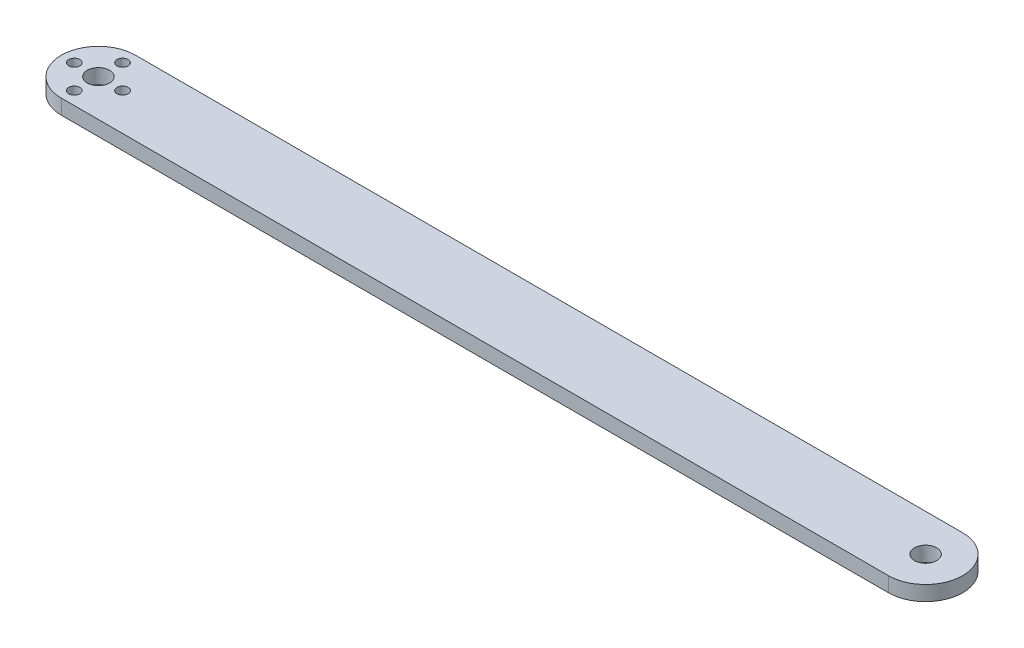
ISO-10303-21;
HEADER;
FILE_DESCRIPTION(('STEP AP214'),'2;1');
FILE_NAME('part.step','',(''),(''),'','','');
FILE_SCHEMA(('AUTOMOTIVE_DESIGN { 1 0 10303 214 1 1 1 1 }'));
ENDSEC;
DATA;
#1=APPLICATION_CONTEXT('core data for automotive mechanical design processes');
#2=APPLICATION_PROTOCOL_DEFINITION('international standard','automotive_design',2000,#1);
#3=PRODUCT_CONTEXT('',#1,'mechanical');
#4=PRODUCT('Part','Part','',(#3));
#5=PRODUCT_RELATED_PRODUCT_CATEGORY('part','',(#4));
#6=PRODUCT_DEFINITION_FORMATION('','',#4);
#7=PRODUCT_DEFINITION_CONTEXT('part definition',#1,'design');
#8=PRODUCT_DEFINITION('design','',#6,#7);
#9=PRODUCT_DEFINITION_SHAPE('','',#8);
#10=(LENGTH_UNIT() NAMED_UNIT(*) SI_UNIT(.MILLI.,.METRE.));
#11=(NAMED_UNIT(*) PLANE_ANGLE_UNIT() SI_UNIT($,.RADIAN.));
#12=(NAMED_UNIT(*) SI_UNIT($,.STERADIAN.) SOLID_ANGLE_UNIT());
#13=UNCERTAINTY_MEASURE_WITH_UNIT(LENGTH_MEASURE(1.E-05),#10,'distance_accuracy_value','');
#14=(GEOMETRIC_REPRESENTATION_CONTEXT(3) GLOBAL_UNCERTAINTY_ASSIGNED_CONTEXT((#13)) GLOBAL_UNIT_ASSIGNED_CONTEXT((#10,
#11,#12)) REPRESENTATION_CONTEXT('',''));
#15=CARTESIAN_POINT('',(0.,0.,0.));
#16=DIRECTION('',(0.,0.,1.));
#17=DIRECTION('',(1.,0.,0.));
#18=AXIS2_PLACEMENT_3D('',#15,#16,#17);
#19=CARTESIAN_POINT('',(-111.375,4.,0.));
#20=DIRECTION('',(0.,1.,0.));
#21=DIRECTION('',(0.,0.,1.));
#22=AXIS2_PLACEMENT_3D('',#19,#20,#21);
#23=PLANE('',#22);
#24=CARTESIAN_POINT('',(-104.875,4.,0.));
#25=DIRECTION('',(0.,1.,0.));
#26=DIRECTION('',(-1.,0.,0.));
#27=AXIS2_PLACEMENT_3D('',#24,#25,#26);
#28=CIRCLE('',#27,1.5);
#29=CARTESIAN_POINT('',(-106.375,4.,0.));
#30=VERTEX_POINT('',#29);
#31=EDGE_CURVE('E150',#30,#30,#28,.T.);
#32=ORIENTED_EDGE('',*,*,#31,.F.);
#33=EDGE_LOOP('',(#32));
#34=FACE_BOUND('',#33,.T.);
#35=CARTESIAN_POINT('',(-111.375,4.,6.5));
#36=DIRECTION('',(0.,1.,0.));
#37=DIRECTION('',(0.,0.,-1.));
#38=AXIS2_PLACEMENT_3D('',#35,#36,#37);
#39=CIRCLE('',#38,1.5);
#40=CARTESIAN_POINT('',(-111.375,4.,5.));
#41=VERTEX_POINT('',#40);
#42=EDGE_CURVE('E144',#41,#41,#39,.T.);
#43=ORIENTED_EDGE('',*,*,#42,.F.);
#44=EDGE_LOOP('',(#43));
#45=FACE_BOUND('',#44,.T.);
#46=CARTESIAN_POINT('',(-117.875,4.,0.));
#47=DIRECTION('',(0.,1.,0.));
#48=DIRECTION('',(1.,0.,0.));
#49=AXIS2_PLACEMENT_3D('',#46,#47,#48);
#50=CIRCLE('',#49,1.5);
#51=CARTESIAN_POINT('',(-116.375,4.,0.));
#52=VERTEX_POINT('',#51);
#53=EDGE_CURVE('E138',#52,#52,#50,.T.);
#54=ORIENTED_EDGE('',*,*,#53,.F.);
#55=EDGE_LOOP('',(#54));
#56=FACE_BOUND('',#55,.T.);
#57=CARTESIAN_POINT('',(-111.375,4.,-6.5));
#58=DIRECTION('',(0.,1.,0.));
#59=DIRECTION('',(0.,0.,1.));
#60=AXIS2_PLACEMENT_3D('',#57,#58,#59);
#61=CIRCLE('',#60,1.5);
#62=CARTESIAN_POINT('',(-111.375,4.,-5.));
#63=VERTEX_POINT('',#62);
#64=EDGE_CURVE('E132',#63,#63,#61,.T.);
#65=ORIENTED_EDGE('',*,*,#64,.F.);
#66=EDGE_LOOP('',(#65));
#67=FACE_BOUND('',#66,.T.);
#68=CARTESIAN_POINT('',(-111.375,4.,0.));
#69=DIRECTION('',(0.,1.,0.));
#70=DIRECTION('',(0.,0.,1.));
#71=AXIS2_PLACEMENT_3D('',#68,#69,#70);
#72=CIRCLE('',#71,3.00000000000001);
#73=CARTESIAN_POINT('',(-111.375,4.,3.00000000000001));
#74=VERTEX_POINT('',#73);
#75=EDGE_CURVE('E108',#74,#74,#72,.T.);
#76=ORIENTED_EDGE('',*,*,#75,.F.);
#77=EDGE_LOOP('',(#76));
#78=FACE_BOUND('',#77,.T.);
#79=CARTESIAN_POINT('',(-111.375,4.,0.));
#80=DIRECTION('',(0.,1.,0.));
#81=DIRECTION('',(0.,0.,1.));
#82=AXIS2_PLACEMENT_3D('',#79,#80,#81);
#83=CIRCLE('',#82,10.);
#84=CARTESIAN_POINT('',(-111.375,4.,-10.));
#85=VERTEX_POINT('',#84);
#86=CARTESIAN_POINT('',(-111.375,4.,10.));
#87=VERTEX_POINT('',#86);
#88=EDGE_CURVE('E93',#85,#87,#83,.T.);
#89=ORIENTED_EDGE('',*,*,#88,.T.);
#90=DIRECTION('',(1.,0.,0.));
#91=VECTOR('',#90,1.);
#92=CARTESIAN_POINT('',(-111.375,4.,10.));
#93=LINE('',#92,#91);
#94=CARTESIAN_POINT('',(111.375,4.,10.));
#95=VERTEX_POINT('',#94);
#96=EDGE_CURVE('E88',#87,#95,#93,.T.);
#97=ORIENTED_EDGE('',*,*,#96,.T.);
#98=CARTESIAN_POINT('',(111.375,4.,0.));
#99=DIRECTION('',(0.,1.,0.));
#100=DIRECTION('',(0.,0.,1.));
#101=AXIS2_PLACEMENT_3D('',#98,#99,#100);
#102=CIRCLE('',#101,10.);
#103=CARTESIAN_POINT('',(111.375,4.,-10.));
#104=VERTEX_POINT('',#103);
#105=EDGE_CURVE('E91',#95,#104,#102,.T.);
#106=ORIENTED_EDGE('',*,*,#105,.T.);
#107=DIRECTION('',(-1.,0.,0.));
#108=VECTOR('',#107,1.);
#109=CARTESIAN_POINT('',(-111.375,4.,-10.));
#110=LINE('',#109,#108);
#111=EDGE_CURVE('E58',#104,#85,#110,.T.);
#112=ORIENTED_EDGE('',*,*,#111,.T.);
#113=EDGE_LOOP('',(#89,#97,#106,#112));
#114=FACE_BOUND('',#113,.T.);
#115=CARTESIAN_POINT('',(111.375,4.,0.));
#116=DIRECTION('',(0.,1.,0.));
#117=DIRECTION('',(0.,0.,1.));
#118=AXIS2_PLACEMENT_3D('',#115,#116,#117);
#119=CIRCLE('',#118,3.00000000000001);
#120=CARTESIAN_POINT('',(111.375,4.,3.00000000000001));
#121=VERTEX_POINT('',#120);
#122=EDGE_CURVE('E123',#121,#121,#119,.T.);
#123=ORIENTED_EDGE('',*,*,#122,.F.);
#124=EDGE_LOOP('',(#123));
#125=FACE_BOUND('',#124,.T.);
#126=ADVANCED_FACE('F41',(#34,#45,#56,#67,#78,#114,#125),#23,.T.);
#127=CARTESIAN_POINT('',(-111.375,0.,0.));
#128=DIRECTION('',(0.,1.,0.));
#129=DIRECTION('',(0.,0.,1.));
#130=AXIS2_PLACEMENT_3D('',#127,#128,#129);
#131=PLANE('',#130);
#132=CARTESIAN_POINT('',(-104.875,0.,0.));
#133=DIRECTION('',(0.,1.,0.));
#134=DIRECTION('',(-1.,0.,0.));
#135=AXIS2_PLACEMENT_3D('',#132,#133,#134);
#136=CIRCLE('',#135,1.5);
#137=CARTESIAN_POINT('',(-106.375,0.,0.));
#138=VERTEX_POINT('',#137);
#139=EDGE_CURVE('E135',#138,#138,#136,.T.);
#140=ORIENTED_EDGE('',*,*,#139,.T.);
#141=EDGE_LOOP('',(#140));
#142=FACE_BOUND('',#141,.T.);
#143=CARTESIAN_POINT('',(-111.375,0.,6.5));
#144=DIRECTION('',(0.,1.,0.));
#145=DIRECTION('',(0.,0.,-1.));
#146=AXIS2_PLACEMENT_3D('',#143,#144,#145);
#147=CIRCLE('',#146,1.5);
#148=CARTESIAN_POINT('',(-111.375,0.,5.));
#149=VERTEX_POINT('',#148);
#150=EDGE_CURVE('E147',#149,#149,#147,.T.);
#151=ORIENTED_EDGE('',*,*,#150,.T.);
#152=EDGE_LOOP('',(#151));
#153=FACE_BOUND('',#152,.T.);
#154=CARTESIAN_POINT('',(-117.875,0.,0.));
#155=DIRECTION('',(0.,1.,0.));
#156=DIRECTION('',(1.,0.,0.));
#157=AXIS2_PLACEMENT_3D('',#154,#155,#156);
#158=CIRCLE('',#157,1.5);
#159=CARTESIAN_POINT('',(-116.375,0.,0.));
#160=VERTEX_POINT('',#159);
#161=EDGE_CURVE('E141',#160,#160,#158,.T.);
#162=ORIENTED_EDGE('',*,*,#161,.T.);
#163=EDGE_LOOP('',(#162));
#164=FACE_BOUND('',#163,.T.);
#165=CARTESIAN_POINT('',(-111.375,0.,-6.5));
#166=DIRECTION('',(0.,1.,0.));
#167=DIRECTION('',(0.,0.,1.));
#168=AXIS2_PLACEMENT_3D('',#165,#166,#167);
#169=CIRCLE('',#168,1.5);
#170=CARTESIAN_POINT('',(-111.375,0.,-5.));
#171=VERTEX_POINT('',#170);
#172=EDGE_CURVE('E129',#171,#171,#169,.T.);
#173=ORIENTED_EDGE('',*,*,#172,.T.);
#174=EDGE_LOOP('',(#173));
#175=FACE_BOUND('',#174,.T.);
#176=CARTESIAN_POINT('',(-111.375,0.,0.));
#177=DIRECTION('',(0.,1.,0.));
#178=DIRECTION('',(0.,0.,1.));
#179=AXIS2_PLACEMENT_3D('',#176,#177,#178);
#180=CIRCLE('',#179,10.);
#181=CARTESIAN_POINT('',(-111.375,0.,-10.));
#182=VERTEX_POINT('',#181);
#183=CARTESIAN_POINT('',(-111.375,0.,10.));
#184=VERTEX_POINT('',#183);
#185=EDGE_CURVE('E105',#182,#184,#180,.T.);
#186=ORIENTED_EDGE('',*,*,#185,.F.);
#187=DIRECTION('',(-1.,0.,0.));
#188=VECTOR('',#187,1.);
#189=CARTESIAN_POINT('',(-111.375,0.,-10.));
#190=LINE('',#189,#188);
#191=CARTESIAN_POINT('',(111.375,0.,-10.));
#192=VERTEX_POINT('',#191);
#193=EDGE_CURVE('E81',#192,#182,#190,.T.);
#194=ORIENTED_EDGE('',*,*,#193,.F.);
#195=CARTESIAN_POINT('',(111.375,0.,0.));
#196=DIRECTION('',(0.,1.,0.));
#197=DIRECTION('',(0.,0.,1.));
#198=AXIS2_PLACEMENT_3D('',#195,#196,#197);
#199=CIRCLE('',#198,10.);
#200=CARTESIAN_POINT('',(111.375,0.,10.));
#201=VERTEX_POINT('',#200);
#202=EDGE_CURVE('E75',#201,#192,#199,.T.);
#203=ORIENTED_EDGE('',*,*,#202,.F.);
#204=DIRECTION('',(1.,0.,0.));
#205=VECTOR('',#204,1.);
#206=CARTESIAN_POINT('',(-111.375,0.,10.));
#207=LINE('',#206,#205);
#208=EDGE_CURVE('E97',#184,#201,#207,.T.);
#209=ORIENTED_EDGE('',*,*,#208,.F.);
#210=EDGE_LOOP('',(#186,#194,#203,#209));
#211=FACE_BOUND('',#210,.T.);
#212=CARTESIAN_POINT('',(-111.375,0.,0.));
#213=DIRECTION('',(0.,1.,0.));
#214=DIRECTION('',(0.,0.,1.));
#215=AXIS2_PLACEMENT_3D('',#212,#213,#214);
#216=CIRCLE('',#215,3.00000000000001);
#217=CARTESIAN_POINT('',(-111.375,0.,3.00000000000001));
#218=VERTEX_POINT('',#217);
#219=EDGE_CURVE('E120',#218,#218,#216,.T.);
#220=ORIENTED_EDGE('',*,*,#219,.T.);
#221=EDGE_LOOP('',(#220));
#222=FACE_BOUND('',#221,.T.);
#223=CARTESIAN_POINT('',(111.375,0.,0.));
#224=DIRECTION('',(0.,1.,0.));
#225=DIRECTION('',(0.,0.,1.));
#226=AXIS2_PLACEMENT_3D('',#223,#224,#225);
#227=CIRCLE('',#226,3.00000000000001);
#228=CARTESIAN_POINT('',(111.375,0.,3.00000000000001));
#229=VERTEX_POINT('',#228);
#230=EDGE_CURVE('E126',#229,#229,#227,.T.);
#231=ORIENTED_EDGE('',*,*,#230,.T.);
#232=EDGE_LOOP('',(#231));
#233=FACE_BOUND('',#232,.T.);
#234=ADVANCED_FACE('F116',(#142,#153,#164,#175,#211,#222,#233),#131,.F.);
#235=CARTESIAN_POINT('',(-111.375,4.,0.));
#236=DIRECTION('',(0.,-1.,0.));
#237=DIRECTION('',(0.,0.,-1.));
#238=AXIS2_PLACEMENT_3D('',#235,#236,#237);
#239=CYLINDRICAL_SURFACE('',#238,10.);
#240=ORIENTED_EDGE('',*,*,#185,.T.);
#241=DIRECTION('',(0.,-1.,0.));
#242=VECTOR('',#241,1.);
#243=CARTESIAN_POINT('',(-111.375,4.,10.));
#244=LINE('',#243,#242);
#245=EDGE_CURVE('E11',#87,#184,#244,.T.);
#246=ORIENTED_EDGE('',*,*,#245,.F.);
#247=ORIENTED_EDGE('',*,*,#88,.F.);
#248=DIRECTION('',(0.,-1.,0.));
#249=VECTOR('',#248,1.);
#250=CARTESIAN_POINT('',(-111.375,4.,-10.));
#251=LINE('',#250,#249);
#252=EDGE_CURVE('E101',#85,#182,#251,.T.);
#253=ORIENTED_EDGE('',*,*,#252,.T.);
#254=EDGE_LOOP('',(#240,#246,#247,#253));
#255=FACE_BOUND('',#254,.T.);
#256=ADVANCED_FACE('F43',(#255),#239,.T.);
#257=CARTESIAN_POINT('',(-111.375,4.,10.));
#258=DIRECTION('',(0.,0.,-1.));
#259=DIRECTION('',(-1.,0.,0.));
#260=AXIS2_PLACEMENT_3D('',#257,#258,#259);
#261=PLANE('',#260);
#262=ORIENTED_EDGE('',*,*,#208,.T.);
#263=DIRECTION('',(0.,-1.,0.));
#264=VECTOR('',#263,1.);
#265=CARTESIAN_POINT('',(111.375,4.,10.));
#266=LINE('',#265,#264);
#267=EDGE_CURVE('E50',#95,#201,#266,.T.);
#268=ORIENTED_EDGE('',*,*,#267,.F.);
#269=ORIENTED_EDGE('',*,*,#96,.F.);
#270=ORIENTED_EDGE('',*,*,#245,.T.);
#271=EDGE_LOOP('',(#262,#268,#269,#270));
#272=FACE_BOUND('',#271,.T.);
#273=ADVANCED_FACE('F96',(#272),#261,.F.);
#274=CARTESIAN_POINT('',(111.375,4.,0.));
#275=DIRECTION('',(0.,-1.,0.));
#276=DIRECTION('',(0.,0.,-1.));
#277=AXIS2_PLACEMENT_3D('',#274,#275,#276);
#278=CYLINDRICAL_SURFACE('',#277,10.);
#279=ORIENTED_EDGE('',*,*,#202,.T.);
#280=DIRECTION('',(0.,-1.,0.));
#281=VECTOR('',#280,1.);
#282=CARTESIAN_POINT('',(111.375,4.,-10.));
#283=LINE('',#282,#281);
#284=EDGE_CURVE('E98',#104,#192,#283,.T.);
#285=ORIENTED_EDGE('',*,*,#284,.F.);
#286=ORIENTED_EDGE('',*,*,#105,.F.);
#287=ORIENTED_EDGE('',*,*,#267,.T.);
#288=EDGE_LOOP('',(#279,#285,#286,#287));
#289=FACE_BOUND('',#288,.T.);
#290=ADVANCED_FACE('F99',(#289),#278,.T.);
#291=CARTESIAN_POINT('',(-111.375,4.,-10.));
#292=DIRECTION('',(0.,0.,1.));
#293=DIRECTION('',(1.,0.,0.));
#294=AXIS2_PLACEMENT_3D('',#291,#292,#293);
#295=PLANE('',#294);
#296=ORIENTED_EDGE('',*,*,#193,.T.);
#297=ORIENTED_EDGE('',*,*,#252,.F.);
#298=ORIENTED_EDGE('',*,*,#111,.F.);
#299=ORIENTED_EDGE('',*,*,#284,.T.);
#300=EDGE_LOOP('',(#296,#297,#298,#299));
#301=FACE_BOUND('',#300,.T.);
#302=ADVANCED_FACE('F113',(#301),#295,.F.);
#303=CARTESIAN_POINT('',(-111.375,4.,0.));
#304=DIRECTION('',(0.,-1.,0.));
#305=DIRECTION('',(0.,0.,-1.));
#306=AXIS2_PLACEMENT_3D('',#303,#304,#305);
#307=CYLINDRICAL_SURFACE('',#306,3.00000000000001);
#308=ORIENTED_EDGE('',*,*,#75,.T.);
#309=EDGE_LOOP('',(#308));
#310=FACE_BOUND('',#309,.T.);
#311=ORIENTED_EDGE('',*,*,#219,.F.);
#312=EDGE_LOOP('',(#311));
#313=FACE_BOUND('',#312,.T.);
#314=ADVANCED_FACE('F176',(#310,#313),#307,.F.);
#315=CARTESIAN_POINT('',(111.375,4.,0.));
#316=DIRECTION('',(0.,-1.,0.));
#317=DIRECTION('',(0.,0.,-1.));
#318=AXIS2_PLACEMENT_3D('',#315,#316,#317);
#319=CYLINDRICAL_SURFACE('',#318,3.00000000000001);
#320=ORIENTED_EDGE('',*,*,#122,.T.);
#321=EDGE_LOOP('',(#320));
#322=FACE_BOUND('',#321,.T.);
#323=ORIENTED_EDGE('',*,*,#230,.F.);
#324=EDGE_LOOP('',(#323));
#325=FACE_BOUND('',#324,.T.);
#326=ADVANCED_FACE('F179',(#322,#325),#319,.F.);
#327=CARTESIAN_POINT('',(-111.375,0.,-6.5));
#328=DIRECTION('',(0.,1.,0.));
#329=DIRECTION('',(0.,0.,1.));
#330=AXIS2_PLACEMENT_3D('',#327,#328,#329);
#331=CYLINDRICAL_SURFACE('',#330,1.5);
#332=ORIENTED_EDGE('',*,*,#172,.F.);
#333=EDGE_LOOP('',(#332));
#334=FACE_BOUND('',#333,.T.);
#335=ORIENTED_EDGE('',*,*,#64,.T.);
#336=EDGE_LOOP('',(#335));
#337=FACE_BOUND('',#336,.T.);
#338=ADVANCED_FACE('F188',(#334,#337),#331,.F.);
#339=CARTESIAN_POINT('',(-117.875,0.,0.));
#340=DIRECTION('',(0.,1.,0.));
#341=DIRECTION('',(0.,0.,1.));
#342=AXIS2_PLACEMENT_3D('',#339,#340,#341);
#343=CYLINDRICAL_SURFACE('',#342,1.5);
#344=ORIENTED_EDGE('',*,*,#161,.F.);
#345=EDGE_LOOP('',(#344));
#346=FACE_BOUND('',#345,.T.);
#347=ORIENTED_EDGE('',*,*,#53,.T.);
#348=EDGE_LOOP('',(#347));
#349=FACE_BOUND('',#348,.T.);
#350=ADVANCED_FACE('F194',(#346,#349),#343,.F.);
#351=CARTESIAN_POINT('',(-111.375,0.,6.5));
#352=DIRECTION('',(0.,1.,0.));
#353=DIRECTION('',(0.,0.,1.));
#354=AXIS2_PLACEMENT_3D('',#351,#352,#353);
#355=CYLINDRICAL_SURFACE('',#354,1.5);
#356=ORIENTED_EDGE('',*,*,#150,.F.);
#357=EDGE_LOOP('',(#356));
#358=FACE_BOUND('',#357,.T.);
#359=ORIENTED_EDGE('',*,*,#42,.T.);
#360=EDGE_LOOP('',(#359));
#361=FACE_BOUND('',#360,.T.);
#362=ADVANCED_FACE('F161',(#358,#361),#355,.F.);
#363=CARTESIAN_POINT('',(-104.875,0.,0.));
#364=DIRECTION('',(0.,1.,0.));
#365=DIRECTION('',(0.,0.,1.));
#366=AXIS2_PLACEMENT_3D('',#363,#364,#365);
#367=CYLINDRICAL_SURFACE('',#366,1.5);
#368=ORIENTED_EDGE('',*,*,#139,.F.);
#369=EDGE_LOOP('',(#368));
#370=FACE_BOUND('',#369,.T.);
#371=ORIENTED_EDGE('',*,*,#31,.T.);
#372=EDGE_LOOP('',(#371));
#373=FACE_BOUND('',#372,.T.);
#374=ADVANCED_FACE('F158',(#370,#373),#367,.F.);
#375=CLOSED_SHELL('',(#126,#234,#256,#273,#290,#302,#314,#326,#338,#350,#362,#374));
#376=MANIFOLD_SOLID_BREP('B2',#375);
#377=ADVANCED_BREP_SHAPE_REPRESENTATION('',(#18,#376),#14);
#378=SHAPE_DEFINITION_REPRESENTATION(#9,#377);
ENDSEC;
END-ISO-10303-21;
